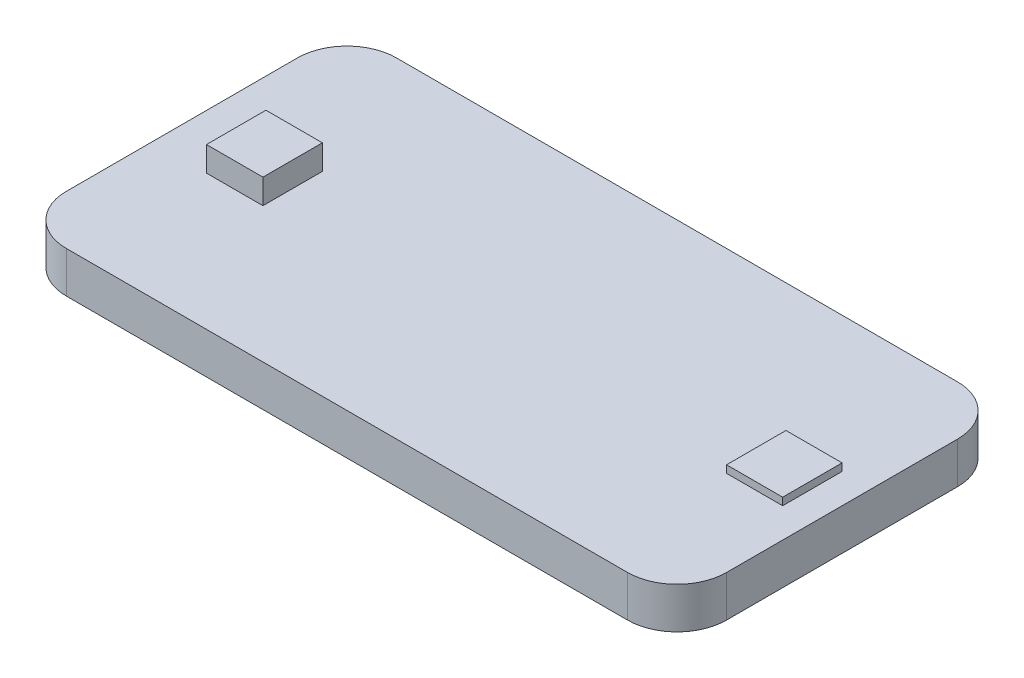
ISO-10303-21;
HEADER;
FILE_DESCRIPTION(('STEP AP214'),'2;1');
FILE_NAME('part.step','',(''),(''),'','','');
FILE_SCHEMA(('AUTOMOTIVE_DESIGN { 1 0 10303 214 1 1 1 1 }'));
ENDSEC;
DATA;
#1=APPLICATION_CONTEXT('core data for automotive mechanical design processes');
#2=APPLICATION_PROTOCOL_DEFINITION('international standard','automotive_design',2000,#1);
#3=PRODUCT_CONTEXT('',#1,'mechanical');
#4=PRODUCT('Part','Part','',(#3));
#5=PRODUCT_RELATED_PRODUCT_CATEGORY('part','',(#4));
#6=PRODUCT_DEFINITION_FORMATION('','',#4);
#7=PRODUCT_DEFINITION_CONTEXT('part definition',#1,'design');
#8=PRODUCT_DEFINITION('design','',#6,#7);
#9=PRODUCT_DEFINITION_SHAPE('','',#8);
#10=(LENGTH_UNIT() NAMED_UNIT(*) SI_UNIT(.MILLI.,.METRE.));
#11=(NAMED_UNIT(*) PLANE_ANGLE_UNIT() SI_UNIT($,.RADIAN.));
#12=(NAMED_UNIT(*) SI_UNIT($,.STERADIAN.) SOLID_ANGLE_UNIT());
#13=UNCERTAINTY_MEASURE_WITH_UNIT(LENGTH_MEASURE(1.E-05),#10,'distance_accuracy_value','');
#14=(GEOMETRIC_REPRESENTATION_CONTEXT(3) GLOBAL_UNCERTAINTY_ASSIGNED_CONTEXT((#13)) GLOBAL_UNIT_ASSIGNED_CONTEXT((#10,
#11,#12)) REPRESENTATION_CONTEXT('',''));
#15=CARTESIAN_POINT('',(0.,0.,0.));
#16=DIRECTION('',(0.,0.,1.));
#17=DIRECTION('',(1.,0.,0.));
#18=AXIS2_PLACEMENT_3D('',#15,#16,#17);
#19=CARTESIAN_POINT('',(0.,50.,0.));
#20=DIRECTION('',(0.,1.,0.));
#21=DIRECTION('',(0.,0.,1.));
#22=AXIS2_PLACEMENT_3D('',#19,#20,#21);
#23=PLANE('',#22);
#24=DIRECTION('',(0.,0.,1.));
#25=VECTOR('',#24,1.);
#26=CARTESIAN_POINT('',(-400.,50.,-200.));
#27=LINE('',#26,#25);
#28=CARTESIAN_POINT('',(-400.,50.,-140.));
#29=VERTEX_POINT('',#28);
#30=CARTESIAN_POINT('',(-400.,50.,140.));
#31=VERTEX_POINT('',#30);
#32=EDGE_CURVE('E281',#29,#31,#27,.T.);
#33=ORIENTED_EDGE('',*,*,#32,.T.);
#34=CARTESIAN_POINT('',(-340.,50.,140.));
#35=DIRECTION('',(0.,1.,0.));
#36=DIRECTION('',(0.,0.,1.));
#37=AXIS2_PLACEMENT_3D('',#34,#35,#36);
#38=CIRCLE('',#37,60.);
#39=CARTESIAN_POINT('',(-340.,50.,200.));
#40=VERTEX_POINT('',#39);
#41=EDGE_CURVE('E337',#31,#40,#38,.T.);
#42=ORIENTED_EDGE('',*,*,#41,.T.);
#43=DIRECTION('',(1.,0.,0.));
#44=VECTOR('',#43,1.);
#45=CARTESIAN_POINT('',(-400.,50.,200.));
#46=LINE('',#45,#44);
#47=CARTESIAN_POINT('',(340.,50.,200.));
#48=VERTEX_POINT('',#47);
#49=EDGE_CURVE('E285',#40,#48,#46,.T.);
#50=ORIENTED_EDGE('',*,*,#49,.T.);
#51=CARTESIAN_POINT('',(340.,50.,140.));
#52=DIRECTION('',(0.,1.,0.));
#53=DIRECTION('',(0.,0.,1.));
#54=AXIS2_PLACEMENT_3D('',#51,#52,#53);
#55=CIRCLE('',#54,60.);
#56=CARTESIAN_POINT('',(400.,50.,140.));
#57=VERTEX_POINT('',#56);
#58=EDGE_CURVE('E328',#48,#57,#55,.T.);
#59=ORIENTED_EDGE('',*,*,#58,.T.);
#60=DIRECTION('',(0.,0.,-1.));
#61=VECTOR('',#60,1.);
#62=CARTESIAN_POINT('',(400.,50.,-200.));
#63=LINE('',#62,#61);
#64=CARTESIAN_POINT('',(400.,50.,-140.));
#65=VERTEX_POINT('',#64);
#66=EDGE_CURVE('E273',#57,#65,#63,.T.);
#67=ORIENTED_EDGE('',*,*,#66,.T.);
#68=CARTESIAN_POINT('',(340.,50.,-140.));
#69=DIRECTION('',(0.,1.,0.));
#70=DIRECTION('',(0.,0.,1.));
#71=AXIS2_PLACEMENT_3D('',#68,#69,#70);
#72=CIRCLE('',#71,60.);
#73=CARTESIAN_POINT('',(340.,50.,-200.));
#74=VERTEX_POINT('',#73);
#75=EDGE_CURVE('E331',#65,#74,#72,.T.);
#76=ORIENTED_EDGE('',*,*,#75,.T.);
#77=DIRECTION('',(-1.,0.,0.));
#78=VECTOR('',#77,1.);
#79=CARTESIAN_POINT('',(-400.,50.,-200.));
#80=LINE('',#79,#78);
#81=CARTESIAN_POINT('',(-340.,50.,-200.));
#82=VERTEX_POINT('',#81);
#83=EDGE_CURVE('E277',#74,#82,#80,.T.);
#84=ORIENTED_EDGE('',*,*,#83,.T.);
#85=CARTESIAN_POINT('',(-340.,50.,-140.));
#86=DIRECTION('',(0.,1.,0.));
#87=DIRECTION('',(0.,0.,1.));
#88=AXIS2_PLACEMENT_3D('',#85,#86,#87);
#89=CIRCLE('',#88,60.);
#90=EDGE_CURVE('E334',#82,#29,#89,.T.);
#91=ORIENTED_EDGE('',*,*,#90,.T.);
#92=EDGE_LOOP('',(#33,#42,#50,#59,#67,#76,#84,#91));
#93=FACE_BOUND('',#92,.T.);
#94=DIRECTION('',(0.,0.,-1.));
#95=VECTOR('',#94,1.);
#96=CARTESIAN_POINT('',(-265.797102764055,50.,-36.0209203041208));
#97=LINE('',#96,#95);
#98=CARTESIAN_POINT('',(-265.797102764055,50.,36.0209203041181));
#99=VERTEX_POINT('',#98);
#100=CARTESIAN_POINT('',(-265.797102764055,50.,-36.0209203041208));
#101=VERTEX_POINT('',#100);
#102=EDGE_CURVE('E222',#99,#101,#97,.T.);
#103=ORIENTED_EDGE('',*,*,#102,.F.);
#104=DIRECTION('',(1.,0.,0.));
#105=VECTOR('',#104,1.);
#106=CARTESIAN_POINT('',(-334.202897235945,50.,36.0209203041181));
#107=LINE('',#106,#105);
#108=CARTESIAN_POINT('',(-334.202897235945,50.,36.0209203041181));
#109=VERTEX_POINT('',#108);
#110=EDGE_CURVE('E74',#109,#99,#107,.T.);
#111=ORIENTED_EDGE('',*,*,#110,.F.);
#112=DIRECTION('',(0.,0.,1.));
#113=VECTOR('',#112,1.);
#114=CARTESIAN_POINT('',(-334.202897235945,50.,-36.0209203041208));
#115=LINE('',#114,#113);
#116=CARTESIAN_POINT('',(-334.202897235945,50.,-36.0209203041208));
#117=VERTEX_POINT('',#116);
#118=EDGE_CURVE('E252',#117,#109,#115,.T.);
#119=ORIENTED_EDGE('',*,*,#118,.F.);
#120=DIRECTION('',(-1.,0.,0.));
#121=VECTOR('',#120,1.);
#122=CARTESIAN_POINT('',(-334.202897235945,50.,-36.0209203041208));
#123=LINE('',#122,#121);
#124=EDGE_CURVE('E229',#101,#117,#123,.T.);
#125=ORIENTED_EDGE('',*,*,#124,.F.);
#126=EDGE_LOOP('',(#103,#111,#119,#125));
#127=FACE_BOUND('',#126,.T.);
#128=DIRECTION('',(-1.,0.,0.));
#129=VECTOR('',#128,1.);
#130=CARTESIAN_POINT('',(296.,50.,-35.9999999999984));
#131=LINE('',#130,#129);
#132=CARTESIAN_POINT('',(364.,50.,-35.9999999999984));
#133=VERTEX_POINT('',#132);
#134=CARTESIAN_POINT('',(296.,50.,-35.9999999999984));
#135=VERTEX_POINT('',#134);
#136=EDGE_CURVE('E612',#133,#135,#131,.T.);
#137=ORIENTED_EDGE('',*,*,#136,.F.);
#138=DIRECTION('',(0.,0.,-1.));
#139=VECTOR('',#138,1.);
#140=CARTESIAN_POINT('',(364.,50.,-35.9999999999984));
#141=LINE('',#140,#139);
#142=CARTESIAN_POINT('',(364.,50.,36.0000000000016));
#143=VERTEX_POINT('',#142);
#144=EDGE_CURVE('E219',#143,#133,#141,.T.);
#145=ORIENTED_EDGE('',*,*,#144,.F.);
#146=DIRECTION('',(1.,0.,0.));
#147=VECTOR('',#146,1.);
#148=CARTESIAN_POINT('',(296.,50.,36.0000000000016));
#149=LINE('',#148,#147);
#150=CARTESIAN_POINT('',(296.,50.,36.0000000000016));
#151=VERTEX_POINT('',#150);
#152=EDGE_CURVE('E215',#151,#143,#149,.T.);
#153=ORIENTED_EDGE('',*,*,#152,.F.);
#154=DIRECTION('',(0.,0.,1.));
#155=VECTOR('',#154,1.);
#156=CARTESIAN_POINT('',(296.,50.,-35.9999999999984));
#157=LINE('',#156,#155);
#158=EDGE_CURVE('E608',#135,#151,#157,.T.);
#159=ORIENTED_EDGE('',*,*,#158,.F.);
#160=EDGE_LOOP('',(#137,#145,#153,#159));
#161=FACE_BOUND('',#160,.T.);
#162=ADVANCED_FACE('F44',(#93,#127,#161),#23,.T.);
#163=CARTESIAN_POINT('',(400.,50.,-200.));
#164=DIRECTION('',(-1.,0.,0.));
#165=DIRECTION('',(0.,0.,1.));
#166=AXIS2_PLACEMENT_3D('',#163,#164,#165);
#167=PLANE('',#166);
#168=DIRECTION('',(0.,0.,-1.));
#169=VECTOR('',#168,1.);
#170=CARTESIAN_POINT('',(400.,0.,-200.));
#171=LINE('',#170,#169);
#172=CARTESIAN_POINT('',(400.,0.,140.));
#173=VERTEX_POINT('',#172);
#174=CARTESIAN_POINT('',(400.,0.,-140.));
#175=VERTEX_POINT('',#174);
#176=EDGE_CURVE('E247',#173,#175,#171,.T.);
#177=ORIENTED_EDGE('',*,*,#176,.T.);
#178=DIRECTION('',(0.,-1.,0.));
#179=VECTOR('',#178,1.);
#180=CARTESIAN_POINT('',(400.,50.,-140.));
#181=LINE('',#180,#179);
#182=EDGE_CURVE('E11',#175,#65,#181,.F.);
#183=ORIENTED_EDGE('',*,*,#182,.T.);
#184=ORIENTED_EDGE('',*,*,#66,.F.);
#185=DIRECTION('',(0.,-1.,0.));
#186=VECTOR('',#185,1.);
#187=CARTESIAN_POINT('',(400.,50.,140.));
#188=LINE('',#187,#186);
#189=EDGE_CURVE('E53',#57,#173,#188,.T.);
#190=ORIENTED_EDGE('',*,*,#189,.T.);
#191=EDGE_LOOP('',(#177,#183,#184,#190));
#192=FACE_BOUND('',#191,.T.);
#193=ADVANCED_FACE('F353',(#192),#167,.F.);
#194=CARTESIAN_POINT('',(-400.,50.,-200.));
#195=DIRECTION('',(0.,0.,1.));
#196=DIRECTION('',(1.,0.,0.));
#197=AXIS2_PLACEMENT_3D('',#194,#195,#196);
#198=PLANE('',#197);
#199=DIRECTION('',(-1.,0.,0.));
#200=VECTOR('',#199,1.);
#201=CARTESIAN_POINT('',(-400.,0.,-200.));
#202=LINE('',#201,#200);
#203=CARTESIAN_POINT('',(340.,0.,-200.));
#204=VERTEX_POINT('',#203);
#205=CARTESIAN_POINT('',(-340.,0.,-200.));
#206=VERTEX_POINT('',#205);
#207=EDGE_CURVE('E293',#204,#206,#202,.T.);
#208=ORIENTED_EDGE('',*,*,#207,.T.);
#209=DIRECTION('',(0.,-1.,0.));
#210=VECTOR('',#209,1.);
#211=CARTESIAN_POINT('',(-340.,50.,-200.));
#212=LINE('',#211,#210);
#213=EDGE_CURVE('E344',#206,#82,#212,.F.);
#214=ORIENTED_EDGE('',*,*,#213,.T.);
#215=ORIENTED_EDGE('',*,*,#83,.F.);
#216=DIRECTION('',(0.,-1.,0.));
#217=VECTOR('',#216,1.);
#218=CARTESIAN_POINT('',(340.,50.,-200.));
#219=LINE('',#218,#217);
#220=EDGE_CURVE('E340',#74,#204,#219,.T.);
#221=ORIENTED_EDGE('',*,*,#220,.T.);
#222=EDGE_LOOP('',(#208,#214,#215,#221));
#223=FACE_BOUND('',#222,.T.);
#224=ADVANCED_FACE('F367',(#223),#198,.F.);
#225=CARTESIAN_POINT('',(-400.,50.,-200.));
#226=DIRECTION('',(1.,0.,0.));
#227=DIRECTION('',(0.,0.,-1.));
#228=AXIS2_PLACEMENT_3D('',#225,#226,#227);
#229=PLANE('',#228);
#230=DIRECTION('',(0.,0.,1.));
#231=VECTOR('',#230,1.);
#232=CARTESIAN_POINT('',(-400.,0.,-200.));
#233=LINE('',#232,#231);
#234=CARTESIAN_POINT('',(-400.,0.,-140.));
#235=VERTEX_POINT('',#234);
#236=CARTESIAN_POINT('',(-400.,0.,140.));
#237=VERTEX_POINT('',#236);
#238=EDGE_CURVE('E297',#235,#237,#233,.T.);
#239=ORIENTED_EDGE('',*,*,#238,.T.);
#240=DIRECTION('',(0.,-1.,0.));
#241=VECTOR('',#240,1.);
#242=CARTESIAN_POINT('',(-400.,50.,140.));
#243=LINE('',#242,#241);
#244=EDGE_CURVE('E325',#237,#31,#243,.F.);
#245=ORIENTED_EDGE('',*,*,#244,.T.);
#246=ORIENTED_EDGE('',*,*,#32,.F.);
#247=DIRECTION('',(0.,-1.,0.));
#248=VECTOR('',#247,1.);
#249=CARTESIAN_POINT('',(-400.,50.,-140.));
#250=LINE('',#249,#248);
#251=EDGE_CURVE('E322',#29,#235,#250,.T.);
#252=ORIENTED_EDGE('',*,*,#251,.T.);
#253=EDGE_LOOP('',(#239,#245,#246,#252));
#254=FACE_BOUND('',#253,.T.);
#255=ADVANCED_FACE('F378',(#254),#229,.F.);
#256=CARTESIAN_POINT('',(-400.,50.,200.));
#257=DIRECTION('',(0.,0.,-1.));
#258=DIRECTION('',(-1.,0.,0.));
#259=AXIS2_PLACEMENT_3D('',#256,#257,#258);
#260=PLANE('',#259);
#261=ORIENTED_EDGE('',*,*,#49,.F.);
#262=DIRECTION('',(0.,-1.,0.));
#263=VECTOR('',#262,1.);
#264=CARTESIAN_POINT('',(-340.,50.,200.));
#265=LINE('',#264,#263);
#266=CARTESIAN_POINT('',(-340.,0.,200.));
#267=VERTEX_POINT('',#266);
#268=EDGE_CURVE('E306',#40,#267,#265,.T.);
#269=ORIENTED_EDGE('',*,*,#268,.T.);
#270=DIRECTION('',(1.,0.,0.));
#271=VECTOR('',#270,1.);
#272=CARTESIAN_POINT('',(-400.,0.,200.));
#273=LINE('',#272,#271);
#274=CARTESIAN_POINT('',(340.,0.,200.));
#275=VERTEX_POINT('',#274);
#276=EDGE_CURVE('E278',#267,#275,#273,.T.);
#277=ORIENTED_EDGE('',*,*,#276,.T.);
#278=DIRECTION('',(0.,-1.,0.));
#279=VECTOR('',#278,1.);
#280=CARTESIAN_POINT('',(340.,50.,200.));
#281=LINE('',#280,#279);
#282=EDGE_CURVE('E289',#275,#48,#281,.F.);
#283=ORIENTED_EDGE('',*,*,#282,.T.);
#284=EDGE_LOOP('',(#261,#269,#277,#283));
#285=FACE_BOUND('',#284,.T.);
#286=ADVANCED_FACE('F386',(#285),#260,.F.);
#287=CARTESIAN_POINT('',(0.,0.,0.));
#288=DIRECTION('',(0.,1.,0.));
#289=DIRECTION('',(0.,0.,1.));
#290=AXIS2_PLACEMENT_3D('',#287,#288,#289);
#291=PLANE('',#290);
#292=ORIENTED_EDGE('',*,*,#276,.F.);
#293=CARTESIAN_POINT('',(-340.,0.,140.));
#294=DIRECTION('',(0.,1.,0.));
#295=DIRECTION('',(0.,0.,1.));
#296=AXIS2_PLACEMENT_3D('',#293,#294,#295);
#297=CIRCLE('',#296,60.);
#298=EDGE_CURVE('E319',#267,#237,#297,.F.);
#299=ORIENTED_EDGE('',*,*,#298,.T.);
#300=ORIENTED_EDGE('',*,*,#238,.F.);
#301=CARTESIAN_POINT('',(-340.,0.,-140.));
#302=DIRECTION('',(0.,1.,0.));
#303=DIRECTION('',(0.,0.,1.));
#304=AXIS2_PLACEMENT_3D('',#301,#302,#303);
#305=CIRCLE('',#304,60.);
#306=EDGE_CURVE('E316',#235,#206,#305,.F.);
#307=ORIENTED_EDGE('',*,*,#306,.T.);
#308=ORIENTED_EDGE('',*,*,#207,.F.);
#309=CARTESIAN_POINT('',(340.,0.,-140.));
#310=DIRECTION('',(0.,1.,0.));
#311=DIRECTION('',(0.,0.,1.));
#312=AXIS2_PLACEMENT_3D('',#309,#310,#311);
#313=CIRCLE('',#312,60.);
#314=EDGE_CURVE('E313',#204,#175,#313,.F.);
#315=ORIENTED_EDGE('',*,*,#314,.T.);
#316=ORIENTED_EDGE('',*,*,#176,.F.);
#317=CARTESIAN_POINT('',(340.,0.,140.));
#318=DIRECTION('',(0.,1.,0.));
#319=DIRECTION('',(0.,0.,1.));
#320=AXIS2_PLACEMENT_3D('',#317,#318,#319);
#321=CIRCLE('',#320,60.);
#322=EDGE_CURVE('E310',#173,#275,#321,.F.);
#323=ORIENTED_EDGE('',*,*,#322,.T.);
#324=EDGE_LOOP('',(#292,#299,#300,#307,#308,#315,#316,#323));
#325=FACE_BOUND('',#324,.T.);
#326=ADVANCED_FACE('F359',(#325),#291,.F.);
#327=CARTESIAN_POINT('',(-340.,50.,140.));
#328=DIRECTION('',(0.,-1.,0.));
#329=DIRECTION('',(0.,0.,-1.));
#330=AXIS2_PLACEMENT_3D('',#327,#328,#329);
#331=CYLINDRICAL_SURFACE('',#330,60.);
#332=ORIENTED_EDGE('',*,*,#41,.F.);
#333=ORIENTED_EDGE('',*,*,#244,.F.);
#334=ORIENTED_EDGE('',*,*,#298,.F.);
#335=ORIENTED_EDGE('',*,*,#268,.F.);
#336=EDGE_LOOP('',(#332,#333,#334,#335));
#337=FACE_BOUND('',#336,.T.);
#338=ADVANCED_FACE('F383',(#337),#331,.T.);
#339=CARTESIAN_POINT('',(-340.,50.,-140.));
#340=DIRECTION('',(0.,-1.,0.));
#341=DIRECTION('',(0.,0.,-1.));
#342=AXIS2_PLACEMENT_3D('',#339,#340,#341);
#343=CYLINDRICAL_SURFACE('',#342,60.);
#344=ORIENTED_EDGE('',*,*,#90,.F.);
#345=ORIENTED_EDGE('',*,*,#213,.F.);
#346=ORIENTED_EDGE('',*,*,#306,.F.);
#347=ORIENTED_EDGE('',*,*,#251,.F.);
#348=EDGE_LOOP('',(#344,#345,#346,#347));
#349=FACE_BOUND('',#348,.T.);
#350=ADVANCED_FACE('F375',(#349),#343,.T.);
#351=CARTESIAN_POINT('',(340.,50.,-140.));
#352=DIRECTION('',(0.,-1.,0.));
#353=DIRECTION('',(0.,0.,-1.));
#354=AXIS2_PLACEMENT_3D('',#351,#352,#353);
#355=CYLINDRICAL_SURFACE('',#354,60.);
#356=ORIENTED_EDGE('',*,*,#75,.F.);
#357=ORIENTED_EDGE('',*,*,#182,.F.);
#358=ORIENTED_EDGE('',*,*,#314,.F.);
#359=ORIENTED_EDGE('',*,*,#220,.F.);
#360=EDGE_LOOP('',(#356,#357,#358,#359));
#361=FACE_BOUND('',#360,.T.);
#362=ADVANCED_FACE('F364',(#361),#355,.T.);
#363=CARTESIAN_POINT('',(340.,50.,140.));
#364=DIRECTION('',(0.,-1.,0.));
#365=DIRECTION('',(0.,0.,-1.));
#366=AXIS2_PLACEMENT_3D('',#363,#364,#365);
#367=CYLINDRICAL_SURFACE('',#366,60.);
#368=ORIENTED_EDGE('',*,*,#58,.F.);
#369=ORIENTED_EDGE('',*,*,#282,.F.);
#370=ORIENTED_EDGE('',*,*,#322,.F.);
#371=ORIENTED_EDGE('',*,*,#189,.F.);
#372=EDGE_LOOP('',(#368,#369,#370,#371));
#373=FACE_BOUND('',#372,.T.);
#374=ADVANCED_FACE('F46',(#373),#367,.T.);
#375=CARTESIAN_POINT('',(-334.202897235945,179.34475082033,36.0209203041181));
#376=DIRECTION('',(0.,0.,-1.));
#377=DIRECTION('',(-1.,0.,0.));
#378=AXIS2_PLACEMENT_3D('',#375,#376,#377);
#379=PLANE('',#378);
#380=DIRECTION('',(0.,-1.,0.));
#381=VECTOR('',#380,1.);
#382=CARTESIAN_POINT('',(-265.797102764055,179.34475082033,36.0209203041181));
#383=LINE('',#382,#381);
#384=CARTESIAN_POINT('',(-265.797102764055,79.9999999999999,36.0209203041181));
#385=VERTEX_POINT('',#384);
#386=EDGE_CURVE('E258',#385,#99,#383,.T.);
#387=ORIENTED_EDGE('',*,*,#386,.F.);
#388=DIRECTION('',(-1.,0.,0.));
#389=VECTOR('',#388,1.);
#390=CARTESIAN_POINT('',(-334.202897235945,79.9999999999999,36.0209203041181));
#391=LINE('',#390,#389);
#392=CARTESIAN_POINT('',(-334.202897235945,79.9999999999999,36.0209203041181));
#393=VERTEX_POINT('',#392);
#394=EDGE_CURVE('E240',#385,#393,#391,.T.);
#395=ORIENTED_EDGE('',*,*,#394,.T.);
#396=DIRECTION('',(0.,-1.,0.));
#397=VECTOR('',#396,1.);
#398=CARTESIAN_POINT('',(-334.202897235945,179.34475082033,36.0209203041181));
#399=LINE('',#398,#397);
#400=EDGE_CURVE('E261',#393,#109,#399,.T.);
#401=ORIENTED_EDGE('',*,*,#400,.T.);
#402=ORIENTED_EDGE('',*,*,#110,.T.);
#403=EDGE_LOOP('',(#387,#395,#401,#402));
#404=FACE_BOUND('',#403,.T.);
#405=ADVANCED_FACE('F389',(#404),#379,.F.);
#406=CARTESIAN_POINT('',(-334.202897235945,179.34475082033,-36.0209203041208));
#407=DIRECTION('',(1.,0.,0.));
#408=DIRECTION('',(0.,0.,-1.));
#409=AXIS2_PLACEMENT_3D('',#406,#407,#408);
#410=PLANE('',#409);
#411=ORIENTED_EDGE('',*,*,#400,.F.);
#412=DIRECTION('',(0.,0.,-1.));
#413=VECTOR('',#412,1.);
#414=CARTESIAN_POINT('',(-334.202897235945,79.9999999999999,-36.0209203041208));
#415=LINE('',#414,#413);
#416=CARTESIAN_POINT('',(-334.202897235945,79.9999999999999,-36.0209203041208));
#417=VERTEX_POINT('',#416);
#418=EDGE_CURVE('E235',#393,#417,#415,.T.);
#419=ORIENTED_EDGE('',*,*,#418,.T.);
#420=DIRECTION('',(0.,-1.,0.));
#421=VECTOR('',#420,1.);
#422=CARTESIAN_POINT('',(-334.202897235945,179.34475082033,-36.0209203041208));
#423=LINE('',#422,#421);
#424=EDGE_CURVE('E264',#417,#117,#423,.T.);
#425=ORIENTED_EDGE('',*,*,#424,.T.);
#426=ORIENTED_EDGE('',*,*,#118,.T.);
#427=EDGE_LOOP('',(#411,#419,#425,#426));
#428=FACE_BOUND('',#427,.T.);
#429=ADVANCED_FACE('F394',(#428),#410,.F.);
#430=CARTESIAN_POINT('',(-334.202897235945,179.34475082033,-36.0209203041208));
#431=DIRECTION('',(0.,0.,1.));
#432=DIRECTION('',(1.,0.,0.));
#433=AXIS2_PLACEMENT_3D('',#430,#431,#432);
#434=PLANE('',#433);
#435=ORIENTED_EDGE('',*,*,#424,.F.);
#436=DIRECTION('',(1.,0.,0.));
#437=VECTOR('',#436,1.);
#438=CARTESIAN_POINT('',(-334.202897235945,79.9999999999999,-36.0209203041208));
#439=LINE('',#438,#437);
#440=CARTESIAN_POINT('',(-265.797102764055,79.9999999999999,-36.0209203041208));
#441=VERTEX_POINT('',#440);
#442=EDGE_CURVE('E239',#417,#441,#439,.T.);
#443=ORIENTED_EDGE('',*,*,#442,.T.);
#444=DIRECTION('',(0.,-1.,0.));
#445=VECTOR('',#444,1.);
#446=CARTESIAN_POINT('',(-265.797102764055,179.34475082033,-36.0209203041208));
#447=LINE('',#446,#445);
#448=EDGE_CURVE('E267',#441,#101,#447,.T.);
#449=ORIENTED_EDGE('',*,*,#448,.T.);
#450=ORIENTED_EDGE('',*,*,#124,.T.);
#451=EDGE_LOOP('',(#435,#443,#449,#450));
#452=FACE_BOUND('',#451,.T.);
#453=ADVANCED_FACE('F439',(#452),#434,.F.);
#454=CARTESIAN_POINT('',(-265.797102764055,179.34475082033,-36.0209203041208));
#455=DIRECTION('',(-1.,0.,0.));
#456=DIRECTION('',(0.,0.,1.));
#457=AXIS2_PLACEMENT_3D('',#454,#455,#456);
#458=PLANE('',#457);
#459=ORIENTED_EDGE('',*,*,#448,.F.);
#460=DIRECTION('',(0.,0.,1.));
#461=VECTOR('',#460,1.);
#462=CARTESIAN_POINT('',(-265.797102764055,79.9999999999999,-36.0209203041208));
#463=LINE('',#462,#461);
#464=EDGE_CURVE('E244',#441,#385,#463,.T.);
#465=ORIENTED_EDGE('',*,*,#464,.T.);
#466=ORIENTED_EDGE('',*,*,#386,.T.);
#467=ORIENTED_EDGE('',*,*,#102,.T.);
#468=EDGE_LOOP('',(#459,#465,#466,#467));
#469=FACE_BOUND('',#468,.T.);
#470=ADVANCED_FACE('F404',(#469),#458,.F.);
#471=CARTESIAN_POINT('',(-273.,79.9999999999999,-16.5000000000014));
#472=DIRECTION('',(0.,-1.,0.));
#473=DIRECTION('',(0.,0.,1.));
#474=AXIS2_PLACEMENT_3D('',#471,#472,#473);
#475=PLANE('',#474);
#476=ORIENTED_EDGE('',*,*,#442,.F.);
#477=ORIENTED_EDGE('',*,*,#418,.F.);
#478=ORIENTED_EDGE('',*,*,#394,.F.);
#479=ORIENTED_EDGE('',*,*,#464,.F.);
#480=EDGE_LOOP('',(#476,#477,#478,#479));
#481=FACE_BOUND('',#480,.T.);
#482=ADVANCED_FACE('F455',(#481),#475,.F.);
#483=CARTESIAN_POINT('',(364.,59.,-35.9999999999984));
#484=DIRECTION('',(-1.,0.,0.));
#485=DIRECTION('',(0.,0.,1.));
#486=AXIS2_PLACEMENT_3D('',#483,#484,#485);
#487=PLANE('',#486);
#488=ORIENTED_EDGE('',*,*,#144,.T.);
#489=DIRECTION('',(0.,-1.,0.));
#490=VECTOR('',#489,1.);
#491=CARTESIAN_POINT('',(364.,59.,-35.9999999999984));
#492=LINE('',#491,#490);
#493=CARTESIAN_POINT('',(364.,59.,-35.9999999999984));
#494=VERTEX_POINT('',#493);
#495=EDGE_CURVE('E198',#494,#133,#492,.T.);
#496=ORIENTED_EDGE('',*,*,#495,.F.);
#497=DIRECTION('',(0.,0.,-1.));
#498=VECTOR('',#497,1.);
#499=CARTESIAN_POINT('',(364.,59.,-35.9999999999984));
#500=LINE('',#499,#498);
#501=CARTESIAN_POINT('',(364.,59.,36.0000000000016));
#502=VERTEX_POINT('',#501);
#503=EDGE_CURVE('E206',#502,#494,#500,.T.);
#504=ORIENTED_EDGE('',*,*,#503,.F.);
#505=DIRECTION('',(0.,-1.,0.));
#506=VECTOR('',#505,1.);
#507=CARTESIAN_POINT('',(364.,59.,36.0000000000016));
#508=LINE('',#507,#506);
#509=EDGE_CURVE('E592',#502,#143,#508,.T.);
#510=ORIENTED_EDGE('',*,*,#509,.T.);
#511=EDGE_LOOP('',(#488,#496,#504,#510));
#512=FACE_BOUND('',#511,.T.);
#513=ADVANCED_FACE('F217',(#512),#487,.F.);
#514=CARTESIAN_POINT('',(296.,59.,-35.9999999999984));
#515=DIRECTION('',(0.,0.,1.));
#516=DIRECTION('',(1.,0.,0.));
#517=AXIS2_PLACEMENT_3D('',#514,#515,#516);
#518=PLANE('',#517);
#519=ORIENTED_EDGE('',*,*,#136,.T.);
#520=DIRECTION('',(0.,-1.,0.));
#521=VECTOR('',#520,1.);
#522=CARTESIAN_POINT('',(296.,59.,-35.9999999999984));
#523=LINE('',#522,#521);
#524=CARTESIAN_POINT('',(296.,59.,-35.9999999999984));
#525=VERTEX_POINT('',#524);
#526=EDGE_CURVE('E201',#525,#135,#523,.T.);
#527=ORIENTED_EDGE('',*,*,#526,.F.);
#528=DIRECTION('',(-1.,0.,0.));
#529=VECTOR('',#528,1.);
#530=CARTESIAN_POINT('',(296.,59.,-35.9999999999984));
#531=LINE('',#530,#529);
#532=EDGE_CURVE('E194',#494,#525,#531,.T.);
#533=ORIENTED_EDGE('',*,*,#532,.F.);
#534=ORIENTED_EDGE('',*,*,#495,.T.);
#535=EDGE_LOOP('',(#519,#527,#533,#534));
#536=FACE_BOUND('',#535,.T.);
#537=ADVANCED_FACE('F196',(#536),#518,.F.);
#538=CARTESIAN_POINT('',(296.,59.,-35.9999999999984));
#539=DIRECTION('',(1.,0.,0.));
#540=DIRECTION('',(0.,0.,-1.));
#541=AXIS2_PLACEMENT_3D('',#538,#539,#540);
#542=PLANE('',#541);
#543=ORIENTED_EDGE('',*,*,#158,.T.);
#544=DIRECTION('',(0.,-1.,0.));
#545=VECTOR('',#544,1.);
#546=CARTESIAN_POINT('',(296.,59.,36.0000000000016));
#547=LINE('',#546,#545);
#548=CARTESIAN_POINT('',(296.,59.,36.0000000000016));
#549=VERTEX_POINT('',#548);
#550=EDGE_CURVE('E64',#549,#151,#547,.T.);
#551=ORIENTED_EDGE('',*,*,#550,.F.);
#552=DIRECTION('',(0.,0.,1.));
#553=VECTOR('',#552,1.);
#554=CARTESIAN_POINT('',(296.,59.,-35.9999999999984));
#555=LINE('',#554,#553);
#556=EDGE_CURVE('E205',#525,#549,#555,.T.);
#557=ORIENTED_EDGE('',*,*,#556,.F.);
#558=ORIENTED_EDGE('',*,*,#526,.T.);
#559=EDGE_LOOP('',(#543,#551,#557,#558));
#560=FACE_BOUND('',#559,.T.);
#561=ADVANCED_FACE('F478',(#560),#542,.F.);
#562=CARTESIAN_POINT('',(296.,59.,36.0000000000016));
#563=DIRECTION('',(0.,0.,-1.));
#564=DIRECTION('',(-1.,0.,0.));
#565=AXIS2_PLACEMENT_3D('',#562,#563,#564);
#566=PLANE('',#565);
#567=ORIENTED_EDGE('',*,*,#152,.T.);
#568=ORIENTED_EDGE('',*,*,#509,.F.);
#569=DIRECTION('',(1.,0.,0.));
#570=VECTOR('',#569,1.);
#571=CARTESIAN_POINT('',(296.,59.,36.0000000000016));
#572=LINE('',#571,#570);
#573=EDGE_CURVE('E210',#549,#502,#572,.T.);
#574=ORIENTED_EDGE('',*,*,#573,.F.);
#575=ORIENTED_EDGE('',*,*,#550,.T.);
#576=EDGE_LOOP('',(#567,#568,#574,#575));
#577=FACE_BOUND('',#576,.T.);
#578=ADVANCED_FACE('F486',(#577),#566,.F.);
#579=CARTESIAN_POINT('',(0.,59.,0.));
#580=DIRECTION('',(0.,1.,0.));
#581=DIRECTION('',(0.,0.,1.));
#582=AXIS2_PLACEMENT_3D('',#579,#580,#581);
#583=PLANE('',#582);
#584=ORIENTED_EDGE('',*,*,#503,.T.);
#585=ORIENTED_EDGE('',*,*,#532,.T.);
#586=ORIENTED_EDGE('',*,*,#556,.T.);
#587=ORIENTED_EDGE('',*,*,#573,.T.);
#588=EDGE_LOOP('',(#584,#585,#586,#587));
#589=FACE_BOUND('',#588,.T.);
#590=ADVANCED_FACE('F209',(#589),#583,.T.);
#591=CLOSED_SHELL('',(#162,#193,#224,#255,#286,#326,#338,#350,#362,#374,#405,#429,#453,#470,
#482,#513,#537,#561,#578,#590));
#592=MANIFOLD_SOLID_BREP('B2',#591);
#593=ADVANCED_BREP_SHAPE_REPRESENTATION('',(#18,#592),#14);
#594=SHAPE_DEFINITION_REPRESENTATION(#9,#593);
ENDSEC;
END-ISO-10303-21;
